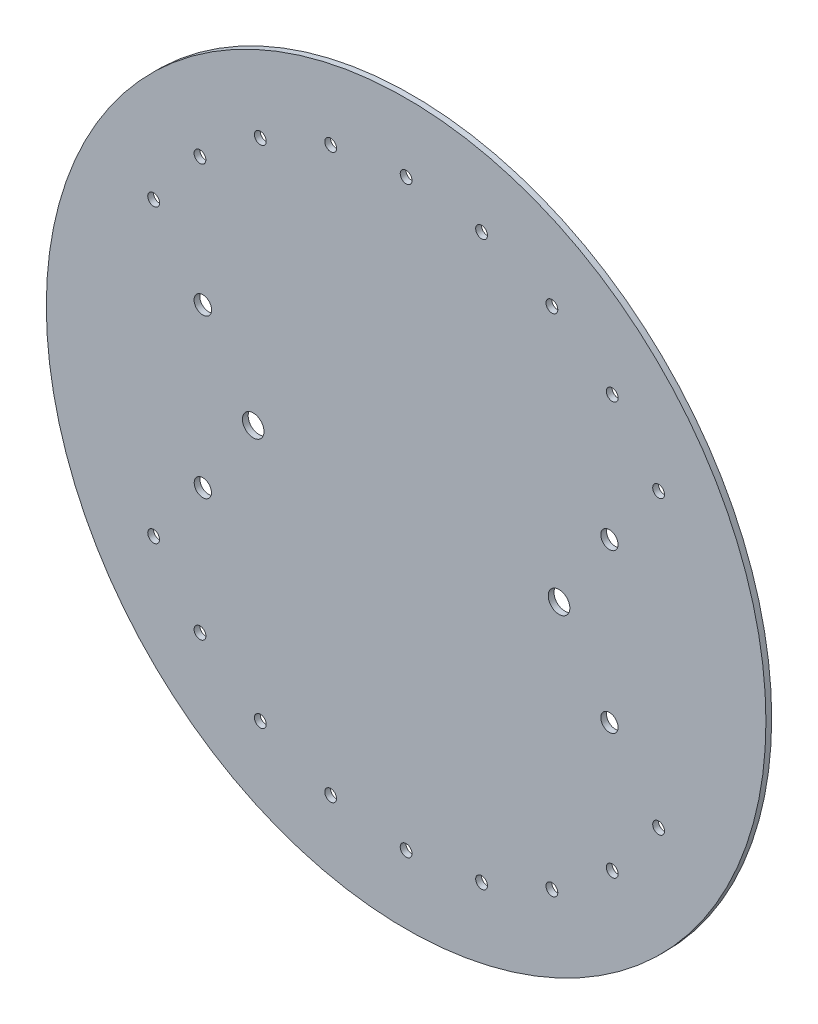
ISO-10303-21;
HEADER;
FILE_DESCRIPTION(('STEP AP214'),'2;1');
FILE_NAME('part.step','',(''),(''),'','','');
FILE_SCHEMA(('AUTOMOTIVE_DESIGN { 1 0 10303 214 1 1 1 1 }'));
ENDSEC;
DATA;
#1=APPLICATION_CONTEXT('core data for automotive mechanical design processes');
#2=APPLICATION_PROTOCOL_DEFINITION('international standard','automotive_design',2000,#1);
#3=PRODUCT_CONTEXT('',#1,'mechanical');
#4=PRODUCT('Part','Part','',(#3));
#5=PRODUCT_RELATED_PRODUCT_CATEGORY('part','',(#4));
#6=PRODUCT_DEFINITION_FORMATION('','',#4);
#7=PRODUCT_DEFINITION_CONTEXT('part definition',#1,'design');
#8=PRODUCT_DEFINITION('design','',#6,#7);
#9=PRODUCT_DEFINITION_SHAPE('','',#8);
#10=(LENGTH_UNIT() NAMED_UNIT(*) SI_UNIT(.MILLI.,.METRE.));
#11=(NAMED_UNIT(*) PLANE_ANGLE_UNIT() SI_UNIT($,.RADIAN.));
#12=(NAMED_UNIT(*) SI_UNIT($,.STERADIAN.) SOLID_ANGLE_UNIT());
#13=UNCERTAINTY_MEASURE_WITH_UNIT(LENGTH_MEASURE(1.E-05),#10,'distance_accuracy_value','');
#14=(GEOMETRIC_REPRESENTATION_CONTEXT(3) GLOBAL_UNCERTAINTY_ASSIGNED_CONTEXT((#13)) GLOBAL_UNIT_ASSIGNED_CONTEXT((#10,
#11,#12)) REPRESENTATION_CONTEXT('',''));
#15=CARTESIAN_POINT('',(0.,0.,0.));
#16=DIRECTION('',(0.,0.,1.));
#17=DIRECTION('',(1.,0.,0.));
#18=AXIS2_PLACEMENT_3D('',#15,#16,#17);
#19=CARTESIAN_POINT('',(0.,0.,4.));
#20=DIRECTION('',(0.,0.,-1.));
#21=DIRECTION('',(-1.,0.,0.));
#22=AXIS2_PLACEMENT_3D('',#19,#20,#21);
#23=CYLINDRICAL_SURFACE('',#22,250.);
#24=CARTESIAN_POINT('',(0.,0.,4.));
#25=DIRECTION('',(0.,0.,1.));
#26=DIRECTION('',(1.,0.,0.));
#27=AXIS2_PLACEMENT_3D('',#24,#25,#26);
#28=CIRCLE('',#27,250.);
#29=CARTESIAN_POINT('',(250.,0.,4.));
#30=VERTEX_POINT('',#29);
#31=EDGE_CURVE('E10',#30,#30,#28,.T.);
#32=ORIENTED_EDGE('',*,*,#31,.F.);
#33=EDGE_LOOP('',(#32));
#34=FACE_BOUND('',#33,.T.);
#35=CARTESIAN_POINT('',(0.,0.,0.));
#36=DIRECTION('',(0.,0.,1.));
#37=DIRECTION('',(1.,0.,0.));
#38=AXIS2_PLACEMENT_3D('',#35,#36,#37);
#39=CIRCLE('',#38,250.);
#40=CARTESIAN_POINT('',(250.,0.,0.));
#41=VERTEX_POINT('',#40);
#42=EDGE_CURVE('E45',#41,#41,#39,.T.);
#43=ORIENTED_EDGE('',*,*,#42,.T.);
#44=EDGE_LOOP('',(#43));
#45=FACE_BOUND('',#44,.T.);
#46=ADVANCED_FACE('F42',(#34,#45),#23,.T.);
#47=CARTESIAN_POINT('',(0.,0.,4.));
#48=DIRECTION('',(0.,0.,1.));
#49=DIRECTION('',(1.,0.,0.));
#50=AXIS2_PLACEMENT_3D('',#47,#48,#49);
#51=PLANE('',#50);
#52=CARTESIAN_POINT('',(52.4253932180176,195.654231096412,4.));
#53=DIRECTION('',(0.,0.,1.));
#54=DIRECTION('',(1.,0.,0.));
#55=AXIS2_PLACEMENT_3D('',#52,#53,#54);
#56=CIRCLE('',#55,4.1);
#57=CARTESIAN_POINT('',(56.5253932180176,195.654231096412,4.));
#58=VERTEX_POINT('',#57);
#59=EDGE_CURVE('E54',#58,#58,#56,.T.);
#60=ORIENTED_EDGE('',*,*,#59,.F.);
#61=EDGE_LOOP('',(#60));
#62=FACE_BOUND('',#61,.T.);
#63=CARTESIAN_POINT('',(1.38777878078145E-12,202.556165050566,4.));
#64=DIRECTION('',(0.,0.,1.));
#65=DIRECTION('',(1.,0.,0.));
#66=AXIS2_PLACEMENT_3D('',#63,#64,#65);
#67=CIRCLE('',#66,4.09999999999997);
#68=CARTESIAN_POINT('',(4.10000000000136,202.556165050566,4.));
#69=VERTEX_POINT('',#68);
#70=EDGE_CURVE('E59',#69,#69,#67,.T.);
#71=ORIENTED_EDGE('',*,*,#70,.F.);
#72=EDGE_LOOP('',(#71));
#73=FACE_BOUND('',#72,.T.);
#74=CARTESIAN_POINT('',(-52.4253932180148,195.654231096413,4.));
#75=DIRECTION('',(0.,0.,1.));
#76=DIRECTION('',(1.,0.,0.));
#77=AXIS2_PLACEMENT_3D('',#74,#75,#76);
#78=CIRCLE('',#77,4.10000000000001);
#79=CARTESIAN_POINT('',(-48.3253932180148,195.654231096413,4.));
#80=VERTEX_POINT('',#79);
#81=EDGE_CURVE('E63',#80,#80,#78,.T.);
#82=ORIENTED_EDGE('',*,*,#81,.F.);
#83=EDGE_LOOP('',(#82));
#84=FACE_BOUND('',#83,.T.);
#85=CARTESIAN_POINT('',(-101.278082525282,175.418784626944,4.));
#86=DIRECTION('',(0.,0.,1.));
#87=DIRECTION('',(1.,0.,0.));
#88=AXIS2_PLACEMENT_3D('',#85,#86,#87);
#89=CIRCLE('',#88,4.10000000000002);
#90=CARTESIAN_POINT('',(-97.178082525282,175.418784626944,4.));
#91=VERTEX_POINT('',#90);
#92=EDGE_CURVE('E67',#91,#91,#89,.T.);
#93=ORIENTED_EDGE('',*,*,#92,.F.);
#94=EDGE_LOOP('',(#93));
#95=FACE_BOUND('',#94,.T.);
#96=CARTESIAN_POINT('',(-143.228837878396,143.228837878398,4.));
#97=DIRECTION('',(0.,0.,1.));
#98=DIRECTION('',(1.,0.,0.));
#99=AXIS2_PLACEMENT_3D('',#96,#97,#98);
#100=CIRCLE('',#99,4.09999999999996);
#101=CARTESIAN_POINT('',(-139.128837878396,143.228837878398,4.));
#102=VERTEX_POINT('',#101);
#103=EDGE_CURVE('E71',#102,#102,#100,.T.);
#104=ORIENTED_EDGE('',*,*,#103,.F.);
#105=EDGE_LOOP('',(#104));
#106=FACE_BOUND('',#105,.T.);
#107=CARTESIAN_POINT('',(-175.418784626943,101.278082525284,4.));
#108=DIRECTION('',(0.,0.,1.));
#109=DIRECTION('',(1.,0.,0.));
#110=AXIS2_PLACEMENT_3D('',#107,#108,#109);
#111=CIRCLE('',#110,4.09999999999998);
#112=CARTESIAN_POINT('',(-171.318784626943,101.278082525284,4.));
#113=VERTEX_POINT('',#112);
#114=EDGE_CURVE('E75',#113,#113,#111,.T.);
#115=ORIENTED_EDGE('',*,*,#114,.F.);
#116=EDGE_LOOP('',(#115));
#117=FACE_BOUND('',#116,.T.);
#118=CARTESIAN_POINT('',(-175.418784626944,-101.278082525283,4.));
#119=DIRECTION('',(0.,0.,1.));
#120=DIRECTION('',(1.,0.,0.));
#121=AXIS2_PLACEMENT_3D('',#118,#119,#120);
#122=CIRCLE('',#121,4.10000000000005);
#123=CARTESIAN_POINT('',(-171.318784626944,-101.278082525283,4.));
#124=VERTEX_POINT('',#123);
#125=EDGE_CURVE('E79',#124,#124,#122,.T.);
#126=ORIENTED_EDGE('',*,*,#125,.F.);
#127=EDGE_LOOP('',(#126));
#128=FACE_BOUND('',#127,.T.);
#129=CARTESIAN_POINT('',(-143.228837878397,-143.228837878397,4.));
#130=DIRECTION('',(0.,0.,1.));
#131=DIRECTION('',(1.,0.,0.));
#132=AXIS2_PLACEMENT_3D('',#129,#130,#131);
#133=CIRCLE('',#132,4.09999999999998);
#134=CARTESIAN_POINT('',(-139.128837878397,-143.228837878397,4.));
#135=VERTEX_POINT('',#134);
#136=EDGE_CURVE('E83',#135,#135,#133,.T.);
#137=ORIENTED_EDGE('',*,*,#136,.F.);
#138=EDGE_LOOP('',(#137));
#139=FACE_BOUND('',#138,.T.);
#140=CARTESIAN_POINT('',(106.238075793812,-7.41856518217393E-13,4.));
#141=DIRECTION('',(0.,0.,1.));
#142=DIRECTION('',(1.,0.,0.));
#143=AXIS2_PLACEMENT_3D('',#140,#141,#142);
#144=CIRCLE('',#143,7.50000000000001);
#145=CARTESIAN_POINT('',(113.738075793812,-7.41856518217393E-13,4.));
#146=VERTEX_POINT('',#145);
#147=EDGE_CURVE('E87',#146,#146,#144,.T.);
#148=ORIENTED_EDGE('',*,*,#147,.F.);
#149=EDGE_LOOP('',(#148));
#150=FACE_BOUND('',#149,.T.);
#151=CARTESIAN_POINT('',(-141.238075793812,55.,4.));
#152=DIRECTION('',(0.,0.,1.));
#153=DIRECTION('',(1.,0.,0.));
#154=AXIS2_PLACEMENT_3D('',#151,#152,#153);
#155=CIRCLE('',#154,6.09999999999998);
#156=CARTESIAN_POINT('',(-135.138075793812,55.,4.));
#157=VERTEX_POINT('',#156);
#158=EDGE_CURVE('E91',#157,#157,#155,.T.);
#159=ORIENTED_EDGE('',*,*,#158,.F.);
#160=EDGE_LOOP('',(#159));
#161=FACE_BOUND('',#160,.T.);
#162=CARTESIAN_POINT('',(0.,-202.556165050566,4.));
#163=DIRECTION('',(0.,0.,1.));
#164=DIRECTION('',(1.,0.,0.));
#165=AXIS2_PLACEMENT_3D('',#162,#163,#164);
#166=CIRCLE('',#165,4.09999999999998);
#167=CARTESIAN_POINT('',(4.09999999999998,-202.556165050566,4.));
#168=VERTEX_POINT('',#167);
#169=EDGE_CURVE('E95',#168,#168,#166,.T.);
#170=ORIENTED_EDGE('',*,*,#169,.F.);
#171=EDGE_LOOP('',(#170));
#172=FACE_BOUND('',#171,.T.);
#173=CARTESIAN_POINT('',(141.238075793816,-55.,4.));
#174=DIRECTION('',(0.,0.,1.));
#175=DIRECTION('',(1.,0.,0.));
#176=AXIS2_PLACEMENT_3D('',#173,#174,#175);
#177=CIRCLE('',#176,6.00000000000489);
#178=CARTESIAN_POINT('',(147.238075793821,-55.,4.));
#179=VERTEX_POINT('',#178);
#180=EDGE_CURVE('E99',#179,#179,#177,.T.);
#181=ORIENTED_EDGE('',*,*,#180,.F.);
#182=EDGE_LOOP('',(#181));
#183=FACE_BOUND('',#182,.T.);
#184=CARTESIAN_POINT('',(-141.238075793812,-55.,4.));
#185=DIRECTION('',(0.,0.,1.));
#186=DIRECTION('',(1.,0.,0.));
#187=AXIS2_PLACEMENT_3D('',#184,#185,#186);
#188=CIRCLE('',#187,6.00000000000005);
#189=CARTESIAN_POINT('',(-135.238075793812,-55.,4.));
#190=VERTEX_POINT('',#189);
#191=EDGE_CURVE('E103',#190,#190,#188,.T.);
#192=ORIENTED_EDGE('',*,*,#191,.F.);
#193=EDGE_LOOP('',(#192));
#194=FACE_BOUND('',#193,.T.);
#195=CARTESIAN_POINT('',(141.238075793812,54.999999999999,4.));
#196=DIRECTION('',(0.,0.,1.));
#197=DIRECTION('',(1.,0.,0.));
#198=AXIS2_PLACEMENT_3D('',#195,#196,#197);
#199=CIRCLE('',#198,6.00000000000005);
#200=CARTESIAN_POINT('',(147.238075793812,54.999999999999,4.));
#201=VERTEX_POINT('',#200);
#202=EDGE_CURVE('E107',#201,#201,#199,.T.);
#203=ORIENTED_EDGE('',*,*,#202,.F.);
#204=EDGE_LOOP('',(#203));
#205=FACE_BOUND('',#204,.T.);
#206=CARTESIAN_POINT('',(-52.4253932180162,-195.654231096413,4.));
#207=DIRECTION('',(0.,0.,1.));
#208=DIRECTION('',(1.,0.,0.));
#209=AXIS2_PLACEMENT_3D('',#206,#207,#208);
#210=CIRCLE('',#209,4.09999999999998);
#211=CARTESIAN_POINT('',(-48.3253932180162,-195.654231096413,4.));
#212=VERTEX_POINT('',#211);
#213=EDGE_CURVE('E111',#212,#212,#210,.T.);
#214=ORIENTED_EDGE('',*,*,#213,.F.);
#215=EDGE_LOOP('',(#214));
#216=FACE_BOUND('',#215,.T.);
#217=CARTESIAN_POINT('',(-101.278082525283,-175.418784626944,4.));
#218=DIRECTION('',(0.,0.,1.));
#219=DIRECTION('',(1.,0.,0.));
#220=AXIS2_PLACEMENT_3D('',#217,#218,#219);
#221=CIRCLE('',#220,4.09999999999998);
#222=CARTESIAN_POINT('',(-97.1780825252832,-175.418784626944,4.));
#223=VERTEX_POINT('',#222);
#224=EDGE_CURVE('E115',#223,#223,#221,.T.);
#225=ORIENTED_EDGE('',*,*,#224,.F.);
#226=EDGE_LOOP('',(#225));
#227=FACE_BOUND('',#226,.T.);
#228=CARTESIAN_POINT('',(101.278082525284,175.418784626943,4.));
#229=DIRECTION('',(0.,0.,1.));
#230=DIRECTION('',(1.,0.,0.));
#231=AXIS2_PLACEMENT_3D('',#228,#229,#230);
#232=CIRCLE('',#231,4.1);
#233=CARTESIAN_POINT('',(105.378082525284,175.418784626943,4.));
#234=VERTEX_POINT('',#233);
#235=EDGE_CURVE('E119',#234,#234,#232,.T.);
#236=ORIENTED_EDGE('',*,*,#235,.F.);
#237=EDGE_LOOP('',(#236));
#238=FACE_BOUND('',#237,.T.);
#239=CARTESIAN_POINT('',(143.228837878398,143.228837878396,4.));
#240=DIRECTION('',(0.,0.,1.));
#241=DIRECTION('',(1.,0.,0.));
#242=AXIS2_PLACEMENT_3D('',#239,#240,#241);
#243=CIRCLE('',#242,4.10000000000002);
#244=CARTESIAN_POINT('',(147.328837878398,143.228837878396,4.));
#245=VERTEX_POINT('',#244);
#246=EDGE_CURVE('E123',#245,#245,#243,.T.);
#247=ORIENTED_EDGE('',*,*,#246,.F.);
#248=EDGE_LOOP('',(#247));
#249=FACE_BOUND('',#248,.T.);
#250=CARTESIAN_POINT('',(175.418784626945,101.278082525281,4.));
#251=DIRECTION('',(0.,0.,1.));
#252=DIRECTION('',(1.,0.,0.));
#253=AXIS2_PLACEMENT_3D('',#250,#251,#252);
#254=CIRCLE('',#253,4.09999999999998);
#255=CARTESIAN_POINT('',(179.518784626945,101.278082525281,4.));
#256=VERTEX_POINT('',#255);
#257=EDGE_CURVE('E127',#256,#256,#254,.T.);
#258=ORIENTED_EDGE('',*,*,#257,.F.);
#259=EDGE_LOOP('',(#258));
#260=FACE_BOUND('',#259,.T.);
#261=CARTESIAN_POINT('',(175.418784626943,-101.278082525285,4.));
#262=DIRECTION('',(0.,0.,1.));
#263=DIRECTION('',(1.,0.,0.));
#264=AXIS2_PLACEMENT_3D('',#261,#262,#263);
#265=CIRCLE('',#264,4.09999999999998);
#266=CARTESIAN_POINT('',(179.518784626943,-101.278082525285,4.));
#267=VERTEX_POINT('',#266);
#268=EDGE_CURVE('E131',#267,#267,#265,.T.);
#269=ORIENTED_EDGE('',*,*,#268,.F.);
#270=EDGE_LOOP('',(#269));
#271=FACE_BOUND('',#270,.T.);
#272=CARTESIAN_POINT('',(143.228837878395,-143.228837878399,4.));
#273=DIRECTION('',(0.,0.,1.));
#274=DIRECTION('',(1.,0.,0.));
#275=AXIS2_PLACEMENT_3D('',#272,#273,#274);
#276=CIRCLE('',#275,4.09999999999998);
#277=CARTESIAN_POINT('',(147.328837878395,-143.228837878399,4.));
#278=VERTEX_POINT('',#277);
#279=EDGE_CURVE('E135',#278,#278,#276,.T.);
#280=ORIENTED_EDGE('',*,*,#279,.F.);
#281=EDGE_LOOP('',(#280));
#282=FACE_BOUND('',#281,.T.);
#283=CARTESIAN_POINT('',(101.278082525281,-175.418784626945,4.));
#284=DIRECTION('',(0.,0.,1.));
#285=DIRECTION('',(1.,0.,0.));
#286=AXIS2_PLACEMENT_3D('',#283,#284,#285);
#287=CIRCLE('',#286,4.1);
#288=CARTESIAN_POINT('',(105.378082525281,-175.418784626945,4.));
#289=VERTEX_POINT('',#288);
#290=EDGE_CURVE('E139',#289,#289,#287,.T.);
#291=ORIENTED_EDGE('',*,*,#290,.F.);
#292=EDGE_LOOP('',(#291));
#293=FACE_BOUND('',#292,.T.);
#294=CARTESIAN_POINT('',(52.4253932180135,-195.654231096413,4.));
#295=DIRECTION('',(0.,0.,1.));
#296=DIRECTION('',(1.,0.,0.));
#297=AXIS2_PLACEMENT_3D('',#294,#295,#296);
#298=CIRCLE('',#297,4.1);
#299=CARTESIAN_POINT('',(56.5253932180135,-195.654231096413,4.));
#300=VERTEX_POINT('',#299);
#301=EDGE_CURVE('E143',#300,#300,#298,.T.);
#302=ORIENTED_EDGE('',*,*,#301,.F.);
#303=EDGE_LOOP('',(#302));
#304=FACE_BOUND('',#303,.T.);
#305=CARTESIAN_POINT('',(-106.238075793812,0.,4.));
#306=DIRECTION('',(0.,0.,1.));
#307=DIRECTION('',(1.,0.,0.));
#308=AXIS2_PLACEMENT_3D('',#305,#306,#307);
#309=CIRCLE('',#308,7.50000000000001);
#310=CARTESIAN_POINT('',(-98.7380757938119,0.,4.));
#311=VERTEX_POINT('',#310);
#312=EDGE_CURVE('E147',#311,#311,#309,.T.);
#313=ORIENTED_EDGE('',*,*,#312,.F.);
#314=EDGE_LOOP('',(#313));
#315=FACE_BOUND('',#314,.T.);
#316=ORIENTED_EDGE('',*,*,#31,.T.);
#317=EDGE_LOOP('',(#316));
#318=FACE_BOUND('',#317,.T.);
#319=ADVANCED_FACE('F268',(#62,#73,#84,#95,#106,#117,#128,#139,#150,#161,#172,#183,#194,#205,
#216,#227,#238,#249,#260,#271,#282,#293,#304,#315,#318),#51,.T.);
#320=CARTESIAN_POINT('',(0.,0.,0.));
#321=DIRECTION('',(0.,0.,1.));
#322=DIRECTION('',(1.,0.,0.));
#323=AXIS2_PLACEMENT_3D('',#320,#321,#322);
#324=PLANE('',#323);
#325=CARTESIAN_POINT('',(52.4253932180176,195.654231096412,0.));
#326=DIRECTION('',(0.,0.,1.));
#327=DIRECTION('',(1.,0.,0.));
#328=AXIS2_PLACEMENT_3D('',#325,#326,#327);
#329=CIRCLE('',#328,4.1);
#330=CARTESIAN_POINT('',(56.5253932180176,195.654231096412,0.));
#331=VERTEX_POINT('',#330);
#332=EDGE_CURVE('E188',#331,#331,#329,.T.);
#333=ORIENTED_EDGE('',*,*,#332,.T.);
#334=EDGE_LOOP('',(#333));
#335=FACE_BOUND('',#334,.T.);
#336=CARTESIAN_POINT('',(1.38777878078145E-12,202.556165050566,0.));
#337=DIRECTION('',(0.,0.,1.));
#338=DIRECTION('',(1.,0.,0.));
#339=AXIS2_PLACEMENT_3D('',#336,#337,#338);
#340=CIRCLE('',#339,4.09999999999997);
#341=CARTESIAN_POINT('',(4.10000000000136,202.556165050566,0.));
#342=VERTEX_POINT('',#341);
#343=EDGE_CURVE('E192',#342,#342,#340,.T.);
#344=ORIENTED_EDGE('',*,*,#343,.T.);
#345=EDGE_LOOP('',(#344));
#346=FACE_BOUND('',#345,.T.);
#347=CARTESIAN_POINT('',(-52.4253932180148,195.654231096413,0.));
#348=DIRECTION('',(0.,0.,1.));
#349=DIRECTION('',(1.,0.,0.));
#350=AXIS2_PLACEMENT_3D('',#347,#348,#349);
#351=CIRCLE('',#350,4.10000000000001);
#352=CARTESIAN_POINT('',(-48.3253932180148,195.654231096413,0.));
#353=VERTEX_POINT('',#352);
#354=EDGE_CURVE('E197',#353,#353,#351,.T.);
#355=ORIENTED_EDGE('',*,*,#354,.T.);
#356=EDGE_LOOP('',(#355));
#357=FACE_BOUND('',#356,.T.);
#358=CARTESIAN_POINT('',(-101.278082525282,175.418784626944,0.));
#359=DIRECTION('',(0.,0.,1.));
#360=DIRECTION('',(1.,0.,0.));
#361=AXIS2_PLACEMENT_3D('',#358,#359,#360);
#362=CIRCLE('',#361,4.10000000000002);
#363=CARTESIAN_POINT('',(-97.178082525282,175.418784626944,0.));
#364=VERTEX_POINT('',#363);
#365=EDGE_CURVE('E201',#364,#364,#362,.T.);
#366=ORIENTED_EDGE('',*,*,#365,.T.);
#367=EDGE_LOOP('',(#366));
#368=FACE_BOUND('',#367,.T.);
#369=CARTESIAN_POINT('',(-143.228837878396,143.228837878398,0.));
#370=DIRECTION('',(0.,0.,1.));
#371=DIRECTION('',(1.,0.,0.));
#372=AXIS2_PLACEMENT_3D('',#369,#370,#371);
#373=CIRCLE('',#372,4.09999999999996);
#374=CARTESIAN_POINT('',(-139.128837878396,143.228837878398,0.));
#375=VERTEX_POINT('',#374);
#376=EDGE_CURVE('E205',#375,#375,#373,.T.);
#377=ORIENTED_EDGE('',*,*,#376,.T.);
#378=EDGE_LOOP('',(#377));
#379=FACE_BOUND('',#378,.T.);
#380=CARTESIAN_POINT('',(-175.418784626943,101.278082525284,0.));
#381=DIRECTION('',(0.,0.,1.));
#382=DIRECTION('',(1.,0.,0.));
#383=AXIS2_PLACEMENT_3D('',#380,#381,#382);
#384=CIRCLE('',#383,4.09999999999998);
#385=CARTESIAN_POINT('',(-171.318784626943,101.278082525284,0.));
#386=VERTEX_POINT('',#385);
#387=EDGE_CURVE('E209',#386,#386,#384,.T.);
#388=ORIENTED_EDGE('',*,*,#387,.T.);
#389=EDGE_LOOP('',(#388));
#390=FACE_BOUND('',#389,.T.);
#391=CARTESIAN_POINT('',(-175.418784626944,-101.278082525283,0.));
#392=DIRECTION('',(0.,0.,1.));
#393=DIRECTION('',(1.,0.,0.));
#394=AXIS2_PLACEMENT_3D('',#391,#392,#393);
#395=CIRCLE('',#394,4.10000000000005);
#396=CARTESIAN_POINT('',(-171.318784626944,-101.278082525283,0.));
#397=VERTEX_POINT('',#396);
#398=EDGE_CURVE('E213',#397,#397,#395,.T.);
#399=ORIENTED_EDGE('',*,*,#398,.T.);
#400=EDGE_LOOP('',(#399));
#401=FACE_BOUND('',#400,.T.);
#402=CARTESIAN_POINT('',(-143.228837878397,-143.228837878397,0.));
#403=DIRECTION('',(0.,0.,1.));
#404=DIRECTION('',(1.,0.,0.));
#405=AXIS2_PLACEMENT_3D('',#402,#403,#404);
#406=CIRCLE('',#405,4.09999999999998);
#407=CARTESIAN_POINT('',(-139.128837878397,-143.228837878397,0.));
#408=VERTEX_POINT('',#407);
#409=EDGE_CURVE('E177',#408,#408,#406,.T.);
#410=ORIENTED_EDGE('',*,*,#409,.T.);
#411=EDGE_LOOP('',(#410));
#412=FACE_BOUND('',#411,.T.);
#413=CARTESIAN_POINT('',(106.238075793812,-7.41856518217393E-13,0.));
#414=DIRECTION('',(0.,0.,1.));
#415=DIRECTION('',(1.,0.,0.));
#416=AXIS2_PLACEMENT_3D('',#413,#414,#415);
#417=CIRCLE('',#416,7.50000000000001);
#418=CARTESIAN_POINT('',(113.738075793812,-7.41856518217393E-13,0.));
#419=VERTEX_POINT('',#418);
#420=EDGE_CURVE('E155',#419,#419,#417,.T.);
#421=ORIENTED_EDGE('',*,*,#420,.T.);
#422=EDGE_LOOP('',(#421));
#423=FACE_BOUND('',#422,.T.);
#424=CARTESIAN_POINT('',(-141.238075793812,55.,0.));
#425=DIRECTION('',(0.,0.,1.));
#426=DIRECTION('',(1.,0.,0.));
#427=AXIS2_PLACEMENT_3D('',#424,#425,#426);
#428=CIRCLE('',#427,6.09999999999998);
#429=CARTESIAN_POINT('',(-135.138075793812,55.,0.));
#430=VERTEX_POINT('',#429);
#431=EDGE_CURVE('E165',#430,#430,#428,.T.);
#432=ORIENTED_EDGE('',*,*,#431,.T.);
#433=EDGE_LOOP('',(#432));
#434=FACE_BOUND('',#433,.T.);
#435=CARTESIAN_POINT('',(0.,-202.556165050566,0.));
#436=DIRECTION('',(0.,0.,1.));
#437=DIRECTION('',(1.,0.,0.));
#438=AXIS2_PLACEMENT_3D('',#435,#436,#437);
#439=CIRCLE('',#438,4.09999999999998);
#440=CARTESIAN_POINT('',(4.09999999999998,-202.556165050566,0.));
#441=VERTEX_POINT('',#440);
#442=EDGE_CURVE('E160',#441,#441,#439,.T.);
#443=ORIENTED_EDGE('',*,*,#442,.T.);
#444=EDGE_LOOP('',(#443));
#445=FACE_BOUND('',#444,.T.);
#446=CARTESIAN_POINT('',(141.238075793816,-55.,0.));
#447=DIRECTION('',(0.,0.,1.));
#448=DIRECTION('',(1.,0.,0.));
#449=AXIS2_PLACEMENT_3D('',#446,#447,#448);
#450=CIRCLE('',#449,6.00000000000489);
#451=CARTESIAN_POINT('',(147.238075793821,-55.,0.));
#452=VERTEX_POINT('',#451);
#453=EDGE_CURVE('E156',#452,#452,#450,.T.);
#454=ORIENTED_EDGE('',*,*,#453,.T.);
#455=EDGE_LOOP('',(#454));
#456=FACE_BOUND('',#455,.T.);
#457=CARTESIAN_POINT('',(-141.238075793812,-55.,0.));
#458=DIRECTION('',(0.,0.,1.));
#459=DIRECTION('',(1.,0.,0.));
#460=AXIS2_PLACEMENT_3D('',#457,#458,#459);
#461=CIRCLE('',#460,6.00000000000005);
#462=CARTESIAN_POINT('',(-135.238075793812,-55.,0.));
#463=VERTEX_POINT('',#462);
#464=EDGE_CURVE('E161',#463,#463,#461,.T.);
#465=ORIENTED_EDGE('',*,*,#464,.T.);
#466=EDGE_LOOP('',(#465));
#467=FACE_BOUND('',#466,.T.);
#468=CARTESIAN_POINT('',(141.238075793812,54.999999999999,0.));
#469=DIRECTION('',(0.,0.,1.));
#470=DIRECTION('',(1.,0.,0.));
#471=AXIS2_PLACEMENT_3D('',#468,#469,#470);
#472=CIRCLE('',#471,6.00000000000005);
#473=CARTESIAN_POINT('',(147.238075793812,54.999999999999,0.));
#474=VERTEX_POINT('',#473);
#475=EDGE_CURVE('E181',#474,#474,#472,.T.);
#476=ORIENTED_EDGE('',*,*,#475,.T.);
#477=EDGE_LOOP('',(#476));
#478=FACE_BOUND('',#477,.T.);
#479=CARTESIAN_POINT('',(-52.4253932180162,-195.654231096413,0.));
#480=DIRECTION('',(0.,0.,1.));
#481=DIRECTION('',(1.,0.,0.));
#482=AXIS2_PLACEMENT_3D('',#479,#480,#481);
#483=CIRCLE('',#482,4.09999999999998);
#484=CARTESIAN_POINT('',(-48.3253932180162,-195.654231096413,0.));
#485=VERTEX_POINT('',#484);
#486=EDGE_CURVE('E176',#485,#485,#483,.T.);
#487=ORIENTED_EDGE('',*,*,#486,.T.);
#488=EDGE_LOOP('',(#487));
#489=FACE_BOUND('',#488,.T.);
#490=CARTESIAN_POINT('',(-101.278082525283,-175.418784626944,0.));
#491=DIRECTION('',(0.,0.,1.));
#492=DIRECTION('',(1.,0.,0.));
#493=AXIS2_PLACEMENT_3D('',#490,#491,#492);
#494=CIRCLE('',#493,4.09999999999998);
#495=CARTESIAN_POINT('',(-97.1780825252832,-175.418784626944,0.));
#496=VERTEX_POINT('',#495);
#497=EDGE_CURVE('E172',#496,#496,#494,.T.);
#498=ORIENTED_EDGE('',*,*,#497,.T.);
#499=EDGE_LOOP('',(#498));
#500=FACE_BOUND('',#499,.T.);
#501=CARTESIAN_POINT('',(101.278082525284,175.418784626943,0.));
#502=DIRECTION('',(0.,0.,1.));
#503=DIRECTION('',(1.,0.,0.));
#504=AXIS2_PLACEMENT_3D('',#501,#502,#503);
#505=CIRCLE('',#504,4.1);
#506=CARTESIAN_POINT('',(105.378082525284,175.418784626943,0.));
#507=VERTEX_POINT('',#506);
#508=EDGE_CURVE('E193',#507,#507,#505,.T.);
#509=ORIENTED_EDGE('',*,*,#508,.T.);
#510=EDGE_LOOP('',(#509));
#511=FACE_BOUND('',#510,.T.);
#512=CARTESIAN_POINT('',(143.228837878398,143.228837878396,0.));
#513=DIRECTION('',(0.,0.,1.));
#514=DIRECTION('',(1.,0.,0.));
#515=AXIS2_PLACEMENT_3D('',#512,#513,#514);
#516=CIRCLE('',#515,4.10000000000002);
#517=CARTESIAN_POINT('',(147.328837878398,143.228837878396,0.));
#518=VERTEX_POINT('',#517);
#519=EDGE_CURVE('E240',#518,#518,#516,.T.);
#520=ORIENTED_EDGE('',*,*,#519,.T.);
#521=EDGE_LOOP('',(#520));
#522=FACE_BOUND('',#521,.T.);
#523=CARTESIAN_POINT('',(175.418784626945,101.278082525281,0.));
#524=DIRECTION('',(0.,0.,1.));
#525=DIRECTION('',(1.,0.,0.));
#526=AXIS2_PLACEMENT_3D('',#523,#524,#525);
#527=CIRCLE('',#526,4.09999999999998);
#528=CARTESIAN_POINT('',(179.518784626945,101.278082525281,0.));
#529=VERTEX_POINT('',#528);
#530=EDGE_CURVE('E236',#529,#529,#527,.T.);
#531=ORIENTED_EDGE('',*,*,#530,.T.);
#532=EDGE_LOOP('',(#531));
#533=FACE_BOUND('',#532,.T.);
#534=CARTESIAN_POINT('',(175.418784626943,-101.278082525285,0.));
#535=DIRECTION('',(0.,0.,1.));
#536=DIRECTION('',(1.,0.,0.));
#537=AXIS2_PLACEMENT_3D('',#534,#535,#536);
#538=CIRCLE('',#537,4.09999999999998);
#539=CARTESIAN_POINT('',(179.518784626943,-101.278082525285,0.));
#540=VERTEX_POINT('',#539);
#541=EDGE_CURVE('E232',#540,#540,#538,.T.);
#542=ORIENTED_EDGE('',*,*,#541,.T.);
#543=EDGE_LOOP('',(#542));
#544=FACE_BOUND('',#543,.T.);
#545=CARTESIAN_POINT('',(143.228837878395,-143.228837878399,0.));
#546=DIRECTION('',(0.,0.,1.));
#547=DIRECTION('',(1.,0.,0.));
#548=AXIS2_PLACEMENT_3D('',#545,#546,#547);
#549=CIRCLE('',#548,4.09999999999998);
#550=CARTESIAN_POINT('',(147.328837878395,-143.228837878399,0.));
#551=VERTEX_POINT('',#550);
#552=EDGE_CURVE('E228',#551,#551,#549,.T.);
#553=ORIENTED_EDGE('',*,*,#552,.T.);
#554=EDGE_LOOP('',(#553));
#555=FACE_BOUND('',#554,.T.);
#556=CARTESIAN_POINT('',(101.278082525281,-175.418784626945,0.));
#557=DIRECTION('',(0.,0.,1.));
#558=DIRECTION('',(1.,0.,0.));
#559=AXIS2_PLACEMENT_3D('',#556,#557,#558);
#560=CIRCLE('',#559,4.1);
#561=CARTESIAN_POINT('',(105.378082525281,-175.418784626945,0.));
#562=VERTEX_POINT('',#561);
#563=EDGE_CURVE('E224',#562,#562,#560,.T.);
#564=ORIENTED_EDGE('',*,*,#563,.T.);
#565=EDGE_LOOP('',(#564));
#566=FACE_BOUND('',#565,.T.);
#567=CARTESIAN_POINT('',(52.4253932180135,-195.654231096413,0.));
#568=DIRECTION('',(0.,0.,1.));
#569=DIRECTION('',(1.,0.,0.));
#570=AXIS2_PLACEMENT_3D('',#567,#568,#569);
#571=CIRCLE('',#570,4.1);
#572=CARTESIAN_POINT('',(56.5253932180135,-195.654231096413,0.));
#573=VERTEX_POINT('',#572);
#574=EDGE_CURVE('E220',#573,#573,#571,.T.);
#575=ORIENTED_EDGE('',*,*,#574,.T.);
#576=EDGE_LOOP('',(#575));
#577=FACE_BOUND('',#576,.T.);
#578=CARTESIAN_POINT('',(-106.238075793812,0.,0.));
#579=DIRECTION('',(0.,0.,1.));
#580=DIRECTION('',(1.,0.,0.));
#581=AXIS2_PLACEMENT_3D('',#578,#579,#580);
#582=CIRCLE('',#581,7.50000000000001);
#583=CARTESIAN_POINT('',(-98.7380757938119,0.,0.));
#584=VERTEX_POINT('',#583);
#585=EDGE_CURVE('E151',#584,#584,#582,.T.);
#586=ORIENTED_EDGE('',*,*,#585,.T.);
#587=EDGE_LOOP('',(#586));
#588=FACE_BOUND('',#587,.T.);
#589=ORIENTED_EDGE('',*,*,#42,.F.);
#590=EDGE_LOOP('',(#589));
#591=FACE_BOUND('',#590,.T.);
#592=ADVANCED_FACE('F248',(#335,#346,#357,#368,#379,#390,#401,#412,#423,#434,#445,#456,#467,
#478,#489,#500,#511,#522,#533,#544,#555,#566,#577,#588,#591),#324,.F.);
#593=CARTESIAN_POINT('',(-106.238075793812,0.,0.));
#594=DIRECTION('',(0.,0.,1.));
#595=DIRECTION('',(1.,0.,0.));
#596=AXIS2_PLACEMENT_3D('',#593,#594,#595);
#597=CYLINDRICAL_SURFACE('',#596,7.50000000000001);
#598=ORIENTED_EDGE('',*,*,#312,.T.);
#599=EDGE_LOOP('',(#598));
#600=FACE_BOUND('',#599,.T.);
#601=ORIENTED_EDGE('',*,*,#585,.F.);
#602=EDGE_LOOP('',(#601));
#603=FACE_BOUND('',#602,.T.);
#604=ADVANCED_FACE('F280',(#600,#603),#597,.F.);
#605=CARTESIAN_POINT('',(52.4253932180135,-195.654231096413,0.));
#606=DIRECTION('',(0.,0.,1.));
#607=DIRECTION('',(1.,0.,0.));
#608=AXIS2_PLACEMENT_3D('',#605,#606,#607);
#609=CYLINDRICAL_SURFACE('',#608,4.1);
#610=ORIENTED_EDGE('',*,*,#301,.T.);
#611=EDGE_LOOP('',(#610));
#612=FACE_BOUND('',#611,.T.);
#613=ORIENTED_EDGE('',*,*,#574,.F.);
#614=EDGE_LOOP('',(#613));
#615=FACE_BOUND('',#614,.T.);
#616=ADVANCED_FACE('F286',(#612,#615),#609,.F.);
#617=CARTESIAN_POINT('',(101.278082525281,-175.418784626945,0.));
#618=DIRECTION('',(0.,0.,1.));
#619=DIRECTION('',(1.,0.,0.));
#620=AXIS2_PLACEMENT_3D('',#617,#618,#619);
#621=CYLINDRICAL_SURFACE('',#620,4.1);
#622=ORIENTED_EDGE('',*,*,#290,.T.);
#623=EDGE_LOOP('',(#622));
#624=FACE_BOUND('',#623,.T.);
#625=ORIENTED_EDGE('',*,*,#563,.F.);
#626=EDGE_LOOP('',(#625));
#627=FACE_BOUND('',#626,.T.);
#628=ADVANCED_FACE('F352',(#624,#627),#621,.F.);
#629=CARTESIAN_POINT('',(143.228837878395,-143.228837878399,0.));
#630=DIRECTION('',(0.,0.,1.));
#631=DIRECTION('',(1.,0.,0.));
#632=AXIS2_PLACEMENT_3D('',#629,#630,#631);
#633=CYLINDRICAL_SURFACE('',#632,4.09999999999998);
#634=ORIENTED_EDGE('',*,*,#279,.T.);
#635=EDGE_LOOP('',(#634));
#636=FACE_BOUND('',#635,.T.);
#637=ORIENTED_EDGE('',*,*,#552,.F.);
#638=EDGE_LOOP('',(#637));
#639=FACE_BOUND('',#638,.T.);
#640=ADVANCED_FACE('F356',(#636,#639),#633,.F.);
#641=CARTESIAN_POINT('',(175.418784626943,-101.278082525285,0.));
#642=DIRECTION('',(0.,0.,1.));
#643=DIRECTION('',(1.,0.,0.));
#644=AXIS2_PLACEMENT_3D('',#641,#642,#643);
#645=CYLINDRICAL_SURFACE('',#644,4.09999999999998);
#646=ORIENTED_EDGE('',*,*,#268,.T.);
#647=EDGE_LOOP('',(#646));
#648=FACE_BOUND('',#647,.T.);
#649=ORIENTED_EDGE('',*,*,#541,.F.);
#650=EDGE_LOOP('',(#649));
#651=FACE_BOUND('',#650,.T.);
#652=ADVANCED_FACE('F360',(#648,#651),#645,.F.);
#653=CARTESIAN_POINT('',(175.418784626945,101.278082525281,0.));
#654=DIRECTION('',(0.,0.,1.));
#655=DIRECTION('',(1.,0.,0.));
#656=AXIS2_PLACEMENT_3D('',#653,#654,#655);
#657=CYLINDRICAL_SURFACE('',#656,4.09999999999998);
#658=ORIENTED_EDGE('',*,*,#257,.T.);
#659=EDGE_LOOP('',(#658));
#660=FACE_BOUND('',#659,.T.);
#661=ORIENTED_EDGE('',*,*,#530,.F.);
#662=EDGE_LOOP('',(#661));
#663=FACE_BOUND('',#662,.T.);
#664=ADVANCED_FACE('F264',(#660,#663),#657,.F.);
#665=CARTESIAN_POINT('',(143.228837878398,143.228837878396,0.));
#666=DIRECTION('',(0.,0.,1.));
#667=DIRECTION('',(1.,0.,0.));
#668=AXIS2_PLACEMENT_3D('',#665,#666,#667);
#669=CYLINDRICAL_SURFACE('',#668,4.10000000000002);
#670=ORIENTED_EDGE('',*,*,#246,.T.);
#671=EDGE_LOOP('',(#670));
#672=FACE_BOUND('',#671,.T.);
#673=ORIENTED_EDGE('',*,*,#519,.F.);
#674=EDGE_LOOP('',(#673));
#675=FACE_BOUND('',#674,.T.);
#676=ADVANCED_FACE('F254',(#672,#675),#669,.F.);
#677=CARTESIAN_POINT('',(101.278082525284,175.418784626943,0.));
#678=DIRECTION('',(0.,0.,1.));
#679=DIRECTION('',(1.,0.,0.));
#680=AXIS2_PLACEMENT_3D('',#677,#678,#679);
#681=CYLINDRICAL_SURFACE('',#680,4.1);
#682=ORIENTED_EDGE('',*,*,#235,.T.);
#683=EDGE_LOOP('',(#682));
#684=FACE_BOUND('',#683,.T.);
#685=ORIENTED_EDGE('',*,*,#508,.F.);
#686=EDGE_LOOP('',(#685));
#687=FACE_BOUND('',#686,.T.);
#688=ADVANCED_FACE('F251',(#684,#687),#681,.F.);
#689=CARTESIAN_POINT('',(-101.278082525283,-175.418784626944,0.));
#690=DIRECTION('',(0.,0.,1.));
#691=DIRECTION('',(1.,0.,0.));
#692=AXIS2_PLACEMENT_3D('',#689,#690,#691);
#693=CYLINDRICAL_SURFACE('',#692,4.09999999999998);
#694=ORIENTED_EDGE('',*,*,#224,.T.);
#695=EDGE_LOOP('',(#694));
#696=FACE_BOUND('',#695,.T.);
#697=ORIENTED_EDGE('',*,*,#497,.F.);
#698=EDGE_LOOP('',(#697));
#699=FACE_BOUND('',#698,.T.);
#700=ADVANCED_FACE('F253',(#696,#699),#693,.F.);
#701=CARTESIAN_POINT('',(-52.4253932180162,-195.654231096413,0.));
#702=DIRECTION('',(0.,0.,1.));
#703=DIRECTION('',(1.,0.,0.));
#704=AXIS2_PLACEMENT_3D('',#701,#702,#703);
#705=CYLINDRICAL_SURFACE('',#704,4.09999999999998);
#706=ORIENTED_EDGE('',*,*,#213,.T.);
#707=EDGE_LOOP('',(#706));
#708=FACE_BOUND('',#707,.T.);
#709=ORIENTED_EDGE('',*,*,#486,.F.);
#710=EDGE_LOOP('',(#709));
#711=FACE_BOUND('',#710,.T.);
#712=ADVANCED_FACE('F261',(#708,#711),#705,.F.);
#713=CARTESIAN_POINT('',(141.238075793812,54.999999999999,0.));
#714=DIRECTION('',(0.,0.,1.));
#715=DIRECTION('',(1.,0.,0.));
#716=AXIS2_PLACEMENT_3D('',#713,#714,#715);
#717=CYLINDRICAL_SURFACE('',#716,6.00000000000005);
#718=ORIENTED_EDGE('',*,*,#202,.T.);
#719=EDGE_LOOP('',(#718));
#720=FACE_BOUND('',#719,.T.);
#721=ORIENTED_EDGE('',*,*,#475,.F.);
#722=EDGE_LOOP('',(#721));
#723=FACE_BOUND('',#722,.T.);
#724=ADVANCED_FACE('F311',(#720,#723),#717,.F.);
#725=CARTESIAN_POINT('',(-141.238075793812,-55.,0.));
#726=DIRECTION('',(0.,0.,1.));
#727=DIRECTION('',(1.,0.,0.));
#728=AXIS2_PLACEMENT_3D('',#725,#726,#727);
#729=CYLINDRICAL_SURFACE('',#728,6.00000000000005);
#730=ORIENTED_EDGE('',*,*,#191,.T.);
#731=EDGE_LOOP('',(#730));
#732=FACE_BOUND('',#731,.T.);
#733=ORIENTED_EDGE('',*,*,#464,.F.);
#734=EDGE_LOOP('',(#733));
#735=FACE_BOUND('',#734,.T.);
#736=ADVANCED_FACE('F295',(#732,#735),#729,.F.);
#737=CARTESIAN_POINT('',(141.238075793816,-55.,0.));
#738=DIRECTION('',(0.,0.,1.));
#739=DIRECTION('',(1.,0.,0.));
#740=AXIS2_PLACEMENT_3D('',#737,#738,#739);
#741=CYLINDRICAL_SURFACE('',#740,6.00000000000489);
#742=ORIENTED_EDGE('',*,*,#180,.T.);
#743=EDGE_LOOP('',(#742));
#744=FACE_BOUND('',#743,.T.);
#745=ORIENTED_EDGE('',*,*,#453,.F.);
#746=EDGE_LOOP('',(#745));
#747=FACE_BOUND('',#746,.T.);
#748=ADVANCED_FACE('F291',(#744,#747),#741,.F.);
#749=CARTESIAN_POINT('',(0.,-202.556165050566,0.));
#750=DIRECTION('',(0.,0.,1.));
#751=DIRECTION('',(1.,0.,0.));
#752=AXIS2_PLACEMENT_3D('',#749,#750,#751);
#753=CYLINDRICAL_SURFACE('',#752,4.09999999999998);
#754=ORIENTED_EDGE('',*,*,#169,.T.);
#755=EDGE_LOOP('',(#754));
#756=FACE_BOUND('',#755,.T.);
#757=ORIENTED_EDGE('',*,*,#442,.F.);
#758=EDGE_LOOP('',(#757));
#759=FACE_BOUND('',#758,.T.);
#760=ADVANCED_FACE('F294',(#756,#759),#753,.F.);
#761=CARTESIAN_POINT('',(-141.238075793812,55.,0.));
#762=DIRECTION('',(0.,0.,1.));
#763=DIRECTION('',(1.,0.,0.));
#764=AXIS2_PLACEMENT_3D('',#761,#762,#763);
#765=CYLINDRICAL_SURFACE('',#764,6.09999999999998);
#766=ORIENTED_EDGE('',*,*,#158,.T.);
#767=EDGE_LOOP('',(#766));
#768=FACE_BOUND('',#767,.T.);
#769=ORIENTED_EDGE('',*,*,#431,.F.);
#770=EDGE_LOOP('',(#769));
#771=FACE_BOUND('',#770,.T.);
#772=ADVANCED_FACE('F299',(#768,#771),#765,.F.);
#773=CARTESIAN_POINT('',(106.238075793812,-7.41856518217393E-13,0.));
#774=DIRECTION('',(0.,0.,1.));
#775=DIRECTION('',(1.,0.,0.));
#776=AXIS2_PLACEMENT_3D('',#773,#774,#775);
#777=CYLINDRICAL_SURFACE('',#776,7.50000000000001);
#778=ORIENTED_EDGE('',*,*,#147,.T.);
#779=EDGE_LOOP('',(#778));
#780=FACE_BOUND('',#779,.T.);
#781=ORIENTED_EDGE('',*,*,#420,.F.);
#782=EDGE_LOOP('',(#781));
#783=FACE_BOUND('',#782,.T.);
#784=ADVANCED_FACE('F303',(#780,#783),#777,.F.);
#785=CARTESIAN_POINT('',(-143.228837878397,-143.228837878397,0.));
#786=DIRECTION('',(0.,0.,1.));
#787=DIRECTION('',(1.,0.,0.));
#788=AXIS2_PLACEMENT_3D('',#785,#786,#787);
#789=CYLINDRICAL_SURFACE('',#788,4.09999999999998);
#790=ORIENTED_EDGE('',*,*,#136,.T.);
#791=EDGE_LOOP('',(#790));
#792=FACE_BOUND('',#791,.T.);
#793=ORIENTED_EDGE('',*,*,#409,.F.);
#794=EDGE_LOOP('',(#793));
#795=FACE_BOUND('',#794,.T.);
#796=ADVANCED_FACE('F306',(#792,#795),#789,.F.);
#797=CARTESIAN_POINT('',(-175.418784626944,-101.278082525283,0.));
#798=DIRECTION('',(0.,0.,1.));
#799=DIRECTION('',(1.,0.,0.));
#800=AXIS2_PLACEMENT_3D('',#797,#798,#799);
#801=CYLINDRICAL_SURFACE('',#800,4.10000000000005);
#802=ORIENTED_EDGE('',*,*,#125,.T.);
#803=EDGE_LOOP('',(#802));
#804=FACE_BOUND('',#803,.T.);
#805=ORIENTED_EDGE('',*,*,#398,.F.);
#806=EDGE_LOOP('',(#805));
#807=FACE_BOUND('',#806,.T.);
#808=ADVANCED_FACE('F342',(#804,#807),#801,.F.);
#809=CARTESIAN_POINT('',(-175.418784626943,101.278082525284,0.));
#810=DIRECTION('',(0.,0.,1.));
#811=DIRECTION('',(1.,0.,0.));
#812=AXIS2_PLACEMENT_3D('',#809,#810,#811);
#813=CYLINDRICAL_SURFACE('',#812,4.09999999999998);
#814=ORIENTED_EDGE('',*,*,#114,.T.);
#815=EDGE_LOOP('',(#814));
#816=FACE_BOUND('',#815,.T.);
#817=ORIENTED_EDGE('',*,*,#387,.F.);
#818=EDGE_LOOP('',(#817));
#819=FACE_BOUND('',#818,.T.);
#820=ADVANCED_FACE('F338',(#816,#819),#813,.F.);
#821=CARTESIAN_POINT('',(-143.228837878396,143.228837878398,0.));
#822=DIRECTION('',(0.,0.,1.));
#823=DIRECTION('',(1.,0.,0.));
#824=AXIS2_PLACEMENT_3D('',#821,#822,#823);
#825=CYLINDRICAL_SURFACE('',#824,4.09999999999996);
#826=ORIENTED_EDGE('',*,*,#103,.T.);
#827=EDGE_LOOP('',(#826));
#828=FACE_BOUND('',#827,.T.);
#829=ORIENTED_EDGE('',*,*,#376,.F.);
#830=EDGE_LOOP('',(#829));
#831=FACE_BOUND('',#830,.T.);
#832=ADVANCED_FACE('F334',(#828,#831),#825,.F.);
#833=CARTESIAN_POINT('',(-101.278082525282,175.418784626944,0.));
#834=DIRECTION('',(0.,0.,1.));
#835=DIRECTION('',(1.,0.,0.));
#836=AXIS2_PLACEMENT_3D('',#833,#834,#835);
#837=CYLINDRICAL_SURFACE('',#836,4.10000000000002);
#838=ORIENTED_EDGE('',*,*,#92,.T.);
#839=EDGE_LOOP('',(#838));
#840=FACE_BOUND('',#839,.T.);
#841=ORIENTED_EDGE('',*,*,#365,.F.);
#842=EDGE_LOOP('',(#841));
#843=FACE_BOUND('',#842,.T.);
#844=ADVANCED_FACE('F330',(#840,#843),#837,.F.);
#845=CARTESIAN_POINT('',(-52.4253932180148,195.654231096413,0.));
#846=DIRECTION('',(0.,0.,1.));
#847=DIRECTION('',(1.,0.,0.));
#848=AXIS2_PLACEMENT_3D('',#845,#846,#847);
#849=CYLINDRICAL_SURFACE('',#848,4.10000000000001);
#850=ORIENTED_EDGE('',*,*,#81,.T.);
#851=EDGE_LOOP('',(#850));
#852=FACE_BOUND('',#851,.T.);
#853=ORIENTED_EDGE('',*,*,#354,.F.);
#854=EDGE_LOOP('',(#853));
#855=FACE_BOUND('',#854,.T.);
#856=ADVANCED_FACE('F326',(#852,#855),#849,.F.);
#857=CARTESIAN_POINT('',(1.38777878078145E-12,202.556165050566,0.));
#858=DIRECTION('',(0.,0.,1.));
#859=DIRECTION('',(1.,0.,0.));
#860=AXIS2_PLACEMENT_3D('',#857,#858,#859);
#861=CYLINDRICAL_SURFACE('',#860,4.09999999999997);
#862=ORIENTED_EDGE('',*,*,#70,.T.);
#863=EDGE_LOOP('',(#862));
#864=FACE_BOUND('',#863,.T.);
#865=ORIENTED_EDGE('',*,*,#343,.F.);
#866=EDGE_LOOP('',(#865));
#867=FACE_BOUND('',#866,.T.);
#868=ADVANCED_FACE('F322',(#864,#867),#861,.F.);
#869=CARTESIAN_POINT('',(52.4253932180176,195.654231096412,0.));
#870=DIRECTION('',(0.,0.,1.));
#871=DIRECTION('',(1.,0.,0.));
#872=AXIS2_PLACEMENT_3D('',#869,#870,#871);
#873=CYLINDRICAL_SURFACE('',#872,4.1);
#874=ORIENTED_EDGE('',*,*,#59,.T.);
#875=EDGE_LOOP('',(#874));
#876=FACE_BOUND('',#875,.T.);
#877=ORIENTED_EDGE('',*,*,#332,.F.);
#878=EDGE_LOOP('',(#877));
#879=FACE_BOUND('',#878,.T.);
#880=ADVANCED_FACE('F319',(#876,#879),#873,.F.);
#881=CLOSED_SHELL('',(#46,#319,#592,#604,#616,#628,#640,#652,#664,#676,#688,#700,#712,#724,#736,
#748,#760,#772,#784,#796,#808,#820,#832,#844,#856,#868,#880));
#882=MANIFOLD_SOLID_BREP('B2',#881);
#883=ADVANCED_BREP_SHAPE_REPRESENTATION('',(#18,#882),#14);
#884=SHAPE_DEFINITION_REPRESENTATION(#9,#883);
ENDSEC;
END-ISO-10303-21;
